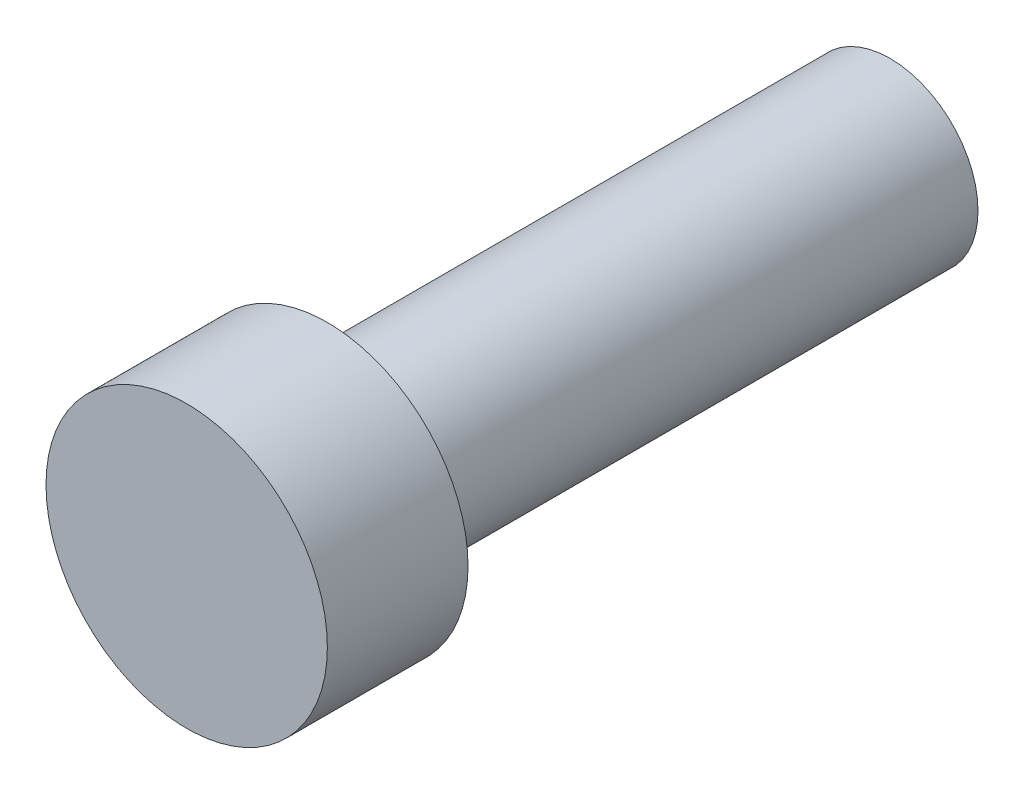
ISO-10303-21;
HEADER;
FILE_DESCRIPTION(('STEP AP214'),'2;1');
FILE_NAME('part.step','',(''),(''),'','','');
FILE_SCHEMA(('AUTOMOTIVE_DESIGN { 1 0 10303 214 1 1 1 1 }'));
ENDSEC;
DATA;
#1=APPLICATION_CONTEXT('core data for automotive mechanical design processes');
#2=APPLICATION_PROTOCOL_DEFINITION('international standard','automotive_design',2000,#1);
#3=PRODUCT_CONTEXT('',#1,'mechanical');
#4=PRODUCT('Part','Part','',(#3));
#5=PRODUCT_RELATED_PRODUCT_CATEGORY('part','',(#4));
#6=PRODUCT_DEFINITION_FORMATION('','',#4);
#7=PRODUCT_DEFINITION_CONTEXT('part definition',#1,'design');
#8=PRODUCT_DEFINITION('design','',#6,#7);
#9=PRODUCT_DEFINITION_SHAPE('','',#8);
#10=(LENGTH_UNIT() NAMED_UNIT(*) SI_UNIT(.MILLI.,.METRE.));
#11=(NAMED_UNIT(*) PLANE_ANGLE_UNIT() SI_UNIT($,.RADIAN.));
#12=(NAMED_UNIT(*) SI_UNIT($,.STERADIAN.) SOLID_ANGLE_UNIT());
#13=UNCERTAINTY_MEASURE_WITH_UNIT(LENGTH_MEASURE(1.E-05),#10,'distance_accuracy_value','');
#14=(GEOMETRIC_REPRESENTATION_CONTEXT(3) GLOBAL_UNCERTAINTY_ASSIGNED_CONTEXT((#13)) GLOBAL_UNIT_ASSIGNED_CONTEXT((#10,
#11,#12)) REPRESENTATION_CONTEXT('',''));
#15=CARTESIAN_POINT('',(0.,0.,0.));
#16=DIRECTION('',(0.,0.,1.));
#17=DIRECTION('',(1.,0.,0.));
#18=AXIS2_PLACEMENT_3D('',#15,#16,#17);
#19=CARTESIAN_POINT('',(0.,0.,25.4));
#20=DIRECTION('',(0.,0.,-1.));
#21=DIRECTION('',(-1.,0.,0.));
#22=AXIS2_PLACEMENT_3D('',#19,#20,#21);
#23=CYLINDRICAL_SURFACE('',#22,5.08);
#24=CARTESIAN_POINT('',(0.,0.,25.4));
#25=DIRECTION('',(0.,0.,-1.));
#26=DIRECTION('',(-1.,0.,0.));
#27=AXIS2_PLACEMENT_3D('',#24,#25,#26);
#28=CIRCLE('',#27,5.08);
#29=CARTESIAN_POINT('',(-5.08,0.,25.4));
#30=VERTEX_POINT('',#29);
#31=EDGE_CURVE('E10',#30,#30,#28,.T.);
#32=ORIENTED_EDGE('',*,*,#31,.T.);
#33=EDGE_LOOP('',(#32));
#34=FACE_BOUND('',#33,.T.);
#35=CARTESIAN_POINT('',(0.,0.,20.32));
#36=DIRECTION('',(0.,0.,-1.));
#37=DIRECTION('',(-1.,0.,0.));
#38=AXIS2_PLACEMENT_3D('',#35,#36,#37);
#39=CIRCLE('',#38,5.08);
#40=CARTESIAN_POINT('',(-5.08,0.,20.32));
#41=VERTEX_POINT('',#40);
#42=EDGE_CURVE('E45',#41,#41,#39,.T.);
#43=ORIENTED_EDGE('',*,*,#42,.F.);
#44=EDGE_LOOP('',(#43));
#45=FACE_BOUND('',#44,.T.);
#46=ADVANCED_FACE('F31',(#34,#45),#23,.T.);
#47=CARTESIAN_POINT('',(5.08,0.,25.4));
#48=DIRECTION('',(0.,0.,1.));
#49=DIRECTION('',(1.,0.,0.));
#50=AXIS2_PLACEMENT_3D('',#47,#48,#49);
#51=PLANE('',#50);
#52=ORIENTED_EDGE('',*,*,#31,.F.);
#53=EDGE_LOOP('',(#52));
#54=FACE_BOUND('',#53,.T.);
#55=ADVANCED_FACE('F55',(#54),#51,.T.);
#56=CARTESIAN_POINT('',(0.,0.,0.));
#57=DIRECTION('',(0.,0.,-1.));
#58=DIRECTION('',(-1.,0.,0.));
#59=AXIS2_PLACEMENT_3D('',#56,#57,#58);
#60=PLANE('',#59);
#61=CARTESIAN_POINT('',(0.,0.,0.));
#62=DIRECTION('',(0.,0.,-1.));
#63=DIRECTION('',(-1.,0.,0.));
#64=AXIS2_PLACEMENT_3D('',#61,#62,#63);
#65=CIRCLE('',#64,3.175);
#66=CARTESIAN_POINT('',(-3.175,0.,0.));
#67=VERTEX_POINT('',#66);
#68=EDGE_CURVE('E37',#67,#67,#65,.T.);
#69=ORIENTED_EDGE('',*,*,#68,.T.);
#70=EDGE_LOOP('',(#69));
#71=FACE_BOUND('',#70,.T.);
#72=ADVANCED_FACE('F59',(#71),#60,.T.);
#73=CARTESIAN_POINT('',(0.,0.,25.4));
#74=DIRECTION('',(0.,0.,-1.));
#75=DIRECTION('',(-1.,0.,0.));
#76=AXIS2_PLACEMENT_3D('',#73,#74,#75);
#77=CYLINDRICAL_SURFACE('',#76,3.175);
#78=CARTESIAN_POINT('',(0.,0.,20.32));
#79=DIRECTION('',(0.,0.,-1.));
#80=DIRECTION('',(-1.,0.,0.));
#81=AXIS2_PLACEMENT_3D('',#78,#79,#80);
#82=CIRCLE('',#81,3.175);
#83=CARTESIAN_POINT('',(-3.17500000000001,0.,20.32));
#84=VERTEX_POINT('',#83);
#85=EDGE_CURVE('E41',#84,#84,#82,.T.);
#86=ORIENTED_EDGE('',*,*,#85,.T.);
#87=EDGE_LOOP('',(#86));
#88=FACE_BOUND('',#87,.T.);
#89=ORIENTED_EDGE('',*,*,#68,.F.);
#90=EDGE_LOOP('',(#89));
#91=FACE_BOUND('',#90,.T.);
#92=ADVANCED_FACE('F64',(#88,#91),#77,.T.);
#93=CARTESIAN_POINT('',(3.175,0.,20.32));
#94=DIRECTION('',(0.,0.,-1.));
#95=DIRECTION('',(-1.,0.,0.));
#96=AXIS2_PLACEMENT_3D('',#93,#94,#95);
#97=PLANE('',#96);
#98=ORIENTED_EDGE('',*,*,#42,.T.);
#99=EDGE_LOOP('',(#98));
#100=FACE_BOUND('',#99,.T.);
#101=ORIENTED_EDGE('',*,*,#85,.F.);
#102=EDGE_LOOP('',(#101));
#103=FACE_BOUND('',#102,.T.);
#104=ADVANCED_FACE('F51',(#100,#103),#97,.T.);
#105=CLOSED_SHELL('',(#46,#55,#72,#92,#104));
#106=MANIFOLD_SOLID_BREP('B2',#105);
#107=ADVANCED_BREP_SHAPE_REPRESENTATION('',(#18,#106),#14);
#108=SHAPE_DEFINITION_REPRESENTATION(#9,#107);
ENDSEC;
END-ISO-10303-21;
